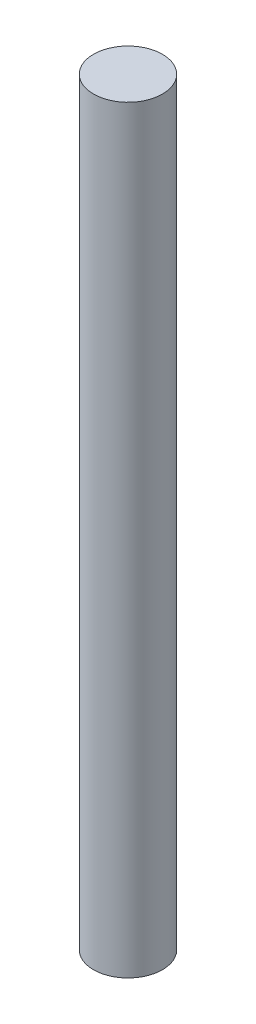
ISO-10303-21;
HEADER;
FILE_DESCRIPTION(('STEP AP214'),'2;1');
FILE_NAME('part.step','',(''),(''),'','','');
FILE_SCHEMA(('AUTOMOTIVE_DESIGN { 1 0 10303 214 1 1 1 1 }'));
ENDSEC;
DATA;
#1=APPLICATION_CONTEXT('core data for automotive mechanical design processes');
#2=APPLICATION_PROTOCOL_DEFINITION('international standard','automotive_design',2000,#1);
#3=PRODUCT_CONTEXT('',#1,'mechanical');
#4=PRODUCT('Part','Part','',(#3));
#5=PRODUCT_RELATED_PRODUCT_CATEGORY('part','',(#4));
#6=PRODUCT_DEFINITION_FORMATION('','',#4);
#7=PRODUCT_DEFINITION_CONTEXT('part definition',#1,'design');
#8=PRODUCT_DEFINITION('design','',#6,#7);
#9=PRODUCT_DEFINITION_SHAPE('','',#8);
#10=(LENGTH_UNIT() NAMED_UNIT(*) SI_UNIT(.MILLI.,.METRE.));
#11=(NAMED_UNIT(*) PLANE_ANGLE_UNIT() SI_UNIT($,.RADIAN.));
#12=(NAMED_UNIT(*) SI_UNIT($,.STERADIAN.) SOLID_ANGLE_UNIT());
#13=UNCERTAINTY_MEASURE_WITH_UNIT(LENGTH_MEASURE(1.E-05),#10,'distance_accuracy_value','');
#14=(GEOMETRIC_REPRESENTATION_CONTEXT(3) GLOBAL_UNCERTAINTY_ASSIGNED_CONTEXT((#13)) GLOBAL_UNIT_ASSIGNED_CONTEXT((#10,
#11,#12)) REPRESENTATION_CONTEXT('',''));
#15=CARTESIAN_POINT('',(0.,0.,0.));
#16=DIRECTION('',(0.,0.,1.));
#17=DIRECTION('',(1.,0.,0.));
#18=AXIS2_PLACEMENT_3D('',#15,#16,#17);
#19=CARTESIAN_POINT('',(0.,16.5,0.));
#20=DIRECTION('',(0.,-1.,0.));
#21=DIRECTION('',(0.,0.,-1.));
#22=AXIS2_PLACEMENT_3D('',#19,#20,#21);
#23=CYLINDRICAL_SURFACE('',#22,1.5);
#24=CARTESIAN_POINT('',(0.,16.5,0.));
#25=DIRECTION('',(0.,1.,0.));
#26=DIRECTION('',(0.,0.,1.));
#27=AXIS2_PLACEMENT_3D('',#24,#25,#26);
#28=CIRCLE('',#27,1.5);
#29=CARTESIAN_POINT('',(0.,16.5,1.5));
#30=VERTEX_POINT('',#29);
#31=EDGE_CURVE('E10',#30,#30,#28,.T.);
#32=ORIENTED_EDGE('',*,*,#31,.F.);
#33=EDGE_LOOP('',(#32));
#34=FACE_BOUND('',#33,.T.);
#35=CARTESIAN_POINT('',(0.,-16.5,0.));
#36=DIRECTION('',(0.,1.,0.));
#37=DIRECTION('',(0.,0.,1.));
#38=AXIS2_PLACEMENT_3D('',#35,#36,#37);
#39=CIRCLE('',#38,1.5);
#40=CARTESIAN_POINT('',(0.,-16.5,1.5));
#41=VERTEX_POINT('',#40);
#42=EDGE_CURVE('E38',#41,#41,#39,.T.);
#43=ORIENTED_EDGE('',*,*,#42,.T.);
#44=EDGE_LOOP('',(#43));
#45=FACE_BOUND('',#44,.T.);
#46=ADVANCED_FACE('F35',(#34,#45),#23,.T.);
#47=CARTESIAN_POINT('',(0.,16.5,0.));
#48=DIRECTION('',(0.,1.,0.));
#49=DIRECTION('',(0.,0.,1.));
#50=AXIS2_PLACEMENT_3D('',#47,#48,#49);
#51=PLANE('',#50);
#52=ORIENTED_EDGE('',*,*,#31,.T.);
#53=EDGE_LOOP('',(#52));
#54=FACE_BOUND('',#53,.T.);
#55=ADVANCED_FACE('F50',(#54),#51,.T.);
#56=CARTESIAN_POINT('',(0.,-16.5,0.));
#57=DIRECTION('',(0.,1.,0.));
#58=DIRECTION('',(0.,0.,1.));
#59=AXIS2_PLACEMENT_3D('',#56,#57,#58);
#60=PLANE('',#59);
#61=ORIENTED_EDGE('',*,*,#42,.F.);
#62=EDGE_LOOP('',(#61));
#63=FACE_BOUND('',#62,.T.);
#64=ADVANCED_FACE('F48',(#63),#60,.F.);
#65=CLOSED_SHELL('',(#46,#55,#64));
#66=MANIFOLD_SOLID_BREP('B2',#65);
#67=ADVANCED_BREP_SHAPE_REPRESENTATION('',(#18,#66),#14);
#68=SHAPE_DEFINITION_REPRESENTATION(#9,#67);
ENDSEC;
END-ISO-10303-21;
